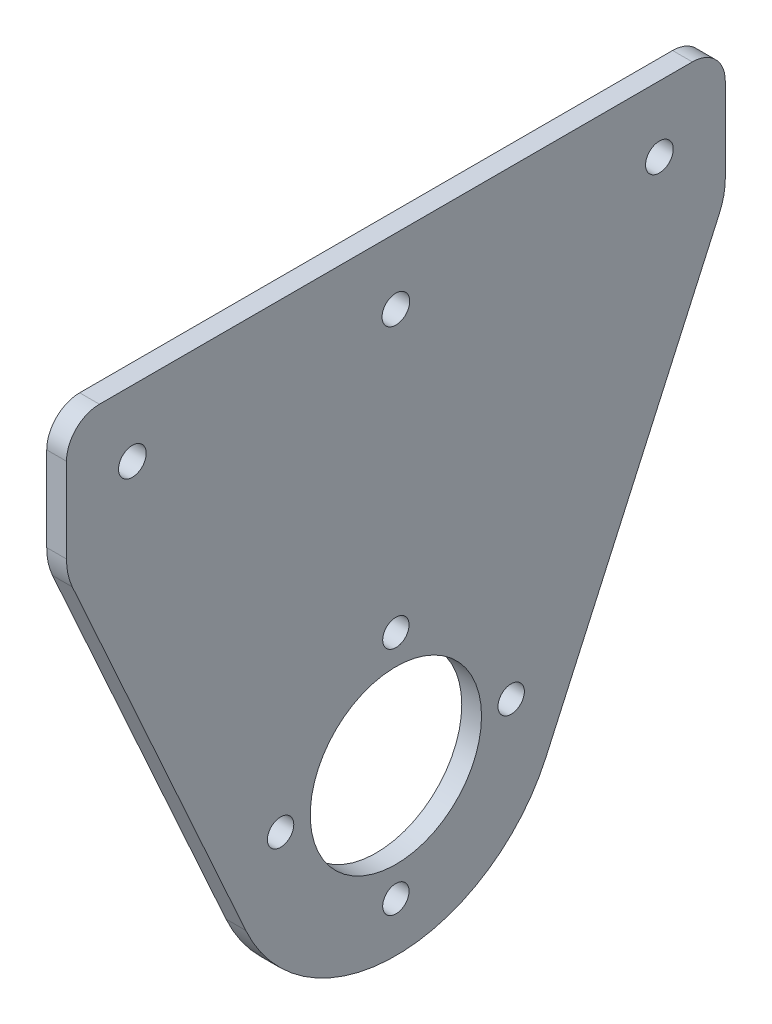
ISO-10303-21;
HEADER;
FILE_DESCRIPTION(('STEP AP214'),'2;1');
FILE_NAME('part.step','',(''),(''),'','','');
FILE_SCHEMA(('AUTOMOTIVE_DESIGN { 1 0 10303 214 1 1 1 1 }'));
ENDSEC;
DATA;
#1=APPLICATION_CONTEXT('core data for automotive mechanical design processes');
#2=APPLICATION_PROTOCOL_DEFINITION('international standard','automotive_design',2000,#1);
#3=PRODUCT_CONTEXT('',#1,'mechanical');
#4=PRODUCT('Part','Part','',(#3));
#5=PRODUCT_RELATED_PRODUCT_CATEGORY('part','',(#4));
#6=PRODUCT_DEFINITION_FORMATION('','',#4);
#7=PRODUCT_DEFINITION_CONTEXT('part definition',#1,'design');
#8=PRODUCT_DEFINITION('design','',#6,#7);
#9=PRODUCT_DEFINITION_SHAPE('','',#8);
#10=(LENGTH_UNIT() NAMED_UNIT(*) SI_UNIT(.MILLI.,.METRE.));
#11=(NAMED_UNIT(*) PLANE_ANGLE_UNIT() SI_UNIT($,.RADIAN.));
#12=(NAMED_UNIT(*) SI_UNIT($,.STERADIAN.) SOLID_ANGLE_UNIT());
#13=UNCERTAINTY_MEASURE_WITH_UNIT(LENGTH_MEASURE(1.E-05),#10,'distance_accuracy_value','');
#14=(GEOMETRIC_REPRESENTATION_CONTEXT(3) GLOBAL_UNCERTAINTY_ASSIGNED_CONTEXT((#13)) GLOBAL_UNIT_ASSIGNED_CONTEXT((#10,
#11,#12)) REPRESENTATION_CONTEXT('',''));
#15=CARTESIAN_POINT('',(0.,0.,0.));
#16=DIRECTION('',(0.,0.,1.));
#17=DIRECTION('',(1.,0.,0.));
#18=AXIS2_PLACEMENT_3D('',#15,#16,#17);
#19=CARTESIAN_POINT('',(3.,0.,0.));
#20=DIRECTION('',(-1.,0.,0.));
#21=DIRECTION('',(0.,0.,1.));
#22=AXIS2_PLACEMENT_3D('',#19,#20,#21);
#23=CYLINDRICAL_SURFACE('',#22,25.);
#24=CARTESIAN_POINT('',(3.,0.,0.));
#25=DIRECTION('',(1.,0.,0.));
#26=DIRECTION('',(0.,0.,-1.));
#27=AXIS2_PLACEMENT_3D('',#24,#25,#26);
#28=CIRCLE('',#27,25.);
#29=CARTESIAN_POINT('',(3.,-10.2859456941537,22.7859456941537));
#30=VERTEX_POINT('',#29);
#31=CARTESIAN_POINT('',(3.,-10.2859456941537,-22.7859456941537));
#32=VERTEX_POINT('',#31);
#33=EDGE_CURVE('E129',#30,#32,#28,.T.);
#34=ORIENTED_EDGE('',*,*,#33,.F.);
#35=DIRECTION('',(1.,0.,0.));
#36=VECTOR('',#35,1.);
#37=CARTESIAN_POINT('',(0.,-10.2859456941537,22.7859456941537));
#38=LINE('',#37,#36);
#39=CARTESIAN_POINT('',(0.,-10.2859456941537,22.7859456941537));
#40=VERTEX_POINT('',#39);
#41=EDGE_CURVE('E119',#40,#30,#38,.T.);
#42=ORIENTED_EDGE('',*,*,#41,.F.);
#43=CARTESIAN_POINT('',(0.,0.,0.));
#44=DIRECTION('',(1.,0.,0.));
#45=DIRECTION('',(0.,0.,-1.));
#46=AXIS2_PLACEMENT_3D('',#43,#44,#45);
#47=CIRCLE('',#46,25.);
#48=CARTESIAN_POINT('',(0.,-10.2859456941537,-22.7859456941537));
#49=VERTEX_POINT('',#48);
#50=EDGE_CURVE('E127',#40,#49,#47,.T.);
#51=ORIENTED_EDGE('',*,*,#50,.T.);
#52=DIRECTION('',(1.,0.,0.));
#53=VECTOR('',#52,1.);
#54=CARTESIAN_POINT('',(0.,-10.2859456941537,-22.7859456941537));
#55=LINE('',#54,#53);
#56=EDGE_CURVE('E273',#49,#32,#55,.T.);
#57=ORIENTED_EDGE('',*,*,#56,.T.);
#58=EDGE_LOOP('',(#34,#42,#51,#57));
#59=FACE_BOUND('',#58,.T.);
#60=ADVANCED_FACE('F41',(#59),#23,.T.);
#61=CARTESIAN_POINT('',(3.,0.,0.));
#62=DIRECTION('',(1.,0.,0.));
#63=DIRECTION('',(0.,0.,-1.));
#64=AXIS2_PLACEMENT_3D('',#61,#62,#63);
#65=PLANE('',#64);
#66=CARTESIAN_POINT('',(3.,60.,40.));
#67=DIRECTION('',(1.,0.,0.));
#68=DIRECTION('',(0.,0.,-1.));
#69=AXIS2_PLACEMENT_3D('',#66,#67,#68);
#70=CIRCLE('',#69,2.1);
#71=CARTESIAN_POINT('',(3.,60.,37.9));
#72=VERTEX_POINT('',#71);
#73=EDGE_CURVE('E467',#72,#72,#70,.T.);
#74=ORIENTED_EDGE('',*,*,#73,.F.);
#75=EDGE_LOOP('',(#74));
#76=FACE_BOUND('',#75,.T.);
#77=CARTESIAN_POINT('',(3.,60.,0.));
#78=DIRECTION('',(1.,0.,0.));
#79=DIRECTION('',(0.,0.,-1.));
#80=AXIS2_PLACEMENT_3D('',#77,#78,#79);
#81=CIRCLE('',#80,2.1);
#82=CARTESIAN_POINT('',(3.,60.,-2.1));
#83=VERTEX_POINT('',#82);
#84=EDGE_CURVE('E468',#83,#83,#81,.T.);
#85=ORIENTED_EDGE('',*,*,#84,.F.);
#86=EDGE_LOOP('',(#85));
#87=FACE_BOUND('',#86,.T.);
#88=CARTESIAN_POINT('',(3.,60.,-40.));
#89=DIRECTION('',(1.,0.,0.));
#90=DIRECTION('',(0.,0.,-1.));
#91=AXIS2_PLACEMENT_3D('',#88,#89,#90);
#92=CIRCLE('',#91,2.1);
#93=CARTESIAN_POINT('',(3.,60.,-42.1));
#94=VERTEX_POINT('',#93);
#95=EDGE_CURVE('E477',#94,#94,#92,.T.);
#96=ORIENTED_EDGE('',*,*,#95,.F.);
#97=EDGE_LOOP('',(#96));
#98=FACE_BOUND('',#97,.T.);
#99=DIRECTION('',(0.,0.911437827766148,-0.411437827766147));
#100=VECTOR('',#99,1.);
#101=CARTESIAN_POINT('',(3.,-10.2859456941537,-22.7859456941537));
#102=LINE('',#101,#100);
#103=CARTESIAN_POINT('',(3.,48.0381260925538,-49.1143782776615));
#104=VERTEX_POINT('',#103);
#105=EDGE_CURVE('E274',#32,#104,#102,.T.);
#106=ORIENTED_EDGE('',*,*,#105,.T.);
#107=CARTESIAN_POINT('',(3.,52.1525043702153,-40.));
#108=DIRECTION('',(1.,0.,0.));
#109=DIRECTION('',(0.,0.,-1.));
#110=AXIS2_PLACEMENT_3D('',#107,#108,#109);
#111=CIRCLE('',#110,10.);
#112=CARTESIAN_POINT('',(3.,52.1525043702153,-50.));
#113=VERTEX_POINT('',#112);
#114=EDGE_CURVE('E170',#104,#113,#111,.T.);
#115=ORIENTED_EDGE('',*,*,#114,.T.);
#116=DIRECTION('',(0.,1.,0.));
#117=VECTOR('',#116,1.);
#118=CARTESIAN_POINT('',(3.,70.,-50.));
#119=LINE('',#118,#117);
#120=CARTESIAN_POINT('',(3.,65.,-50.));
#121=VERTEX_POINT('',#120);
#122=EDGE_CURVE('E190',#113,#121,#119,.T.);
#123=ORIENTED_EDGE('',*,*,#122,.T.);
#124=CARTESIAN_POINT('',(3.,65.,-45.));
#125=DIRECTION('',(1.,0.,0.));
#126=DIRECTION('',(0.,0.,-1.));
#127=AXIS2_PLACEMENT_3D('',#124,#125,#126);
#128=CIRCLE('',#127,5.);
#129=CARTESIAN_POINT('',(3.,70.,-45.));
#130=VERTEX_POINT('',#129);
#131=EDGE_CURVE('E151',#121,#130,#128,.T.);
#132=ORIENTED_EDGE('',*,*,#131,.T.);
#133=DIRECTION('',(0.,0.,1.));
#134=VECTOR('',#133,1.);
#135=CARTESIAN_POINT('',(3.,70.,25.));
#136=LINE('',#135,#134);
#137=CARTESIAN_POINT('',(3.,70.,45.));
#138=VERTEX_POINT('',#137);
#139=EDGE_CURVE('E201',#130,#138,#136,.T.);
#140=ORIENTED_EDGE('',*,*,#139,.T.);
#141=CARTESIAN_POINT('',(3.,65.,45.));
#142=DIRECTION('',(1.,0.,0.));
#143=DIRECTION('',(0.,0.,-1.));
#144=AXIS2_PLACEMENT_3D('',#141,#142,#143);
#145=CIRCLE('',#144,5.);
#146=CARTESIAN_POINT('',(3.,65.,50.));
#147=VERTEX_POINT('',#146);
#148=EDGE_CURVE('E149',#138,#147,#145,.T.);
#149=ORIENTED_EDGE('',*,*,#148,.T.);
#150=DIRECTION('',(0.,-1.,0.));
#151=VECTOR('',#150,1.);
#152=CARTESIAN_POINT('',(3.,70.,50.));
#153=LINE('',#152,#151);
#154=CARTESIAN_POINT('',(3.,52.1525043702153,50.));
#155=VERTEX_POINT('',#154);
#156=EDGE_CURVE('E130',#147,#155,#153,.T.);
#157=ORIENTED_EDGE('',*,*,#156,.T.);
#158=CARTESIAN_POINT('',(3.,52.1525043702153,40.));
#159=DIRECTION('',(1.,0.,0.));
#160=DIRECTION('',(0.,0.,-1.));
#161=AXIS2_PLACEMENT_3D('',#158,#159,#160);
#162=CIRCLE('',#161,10.);
#163=CARTESIAN_POINT('',(3.,48.0381260925538,49.1143782776615));
#164=VERTEX_POINT('',#163);
#165=EDGE_CURVE('E168',#155,#164,#162,.T.);
#166=ORIENTED_EDGE('',*,*,#165,.T.);
#167=DIRECTION('',(0.,-0.911437827766148,-0.411437827766148));
#168=VECTOR('',#167,1.);
#169=CARTESIAN_POINT('',(3.,-10.2859456941537,22.7859456941537));
#170=LINE('',#169,#168);
#171=EDGE_CURVE('E122',#164,#30,#170,.T.);
#172=ORIENTED_EDGE('',*,*,#171,.T.);
#173=ORIENTED_EDGE('',*,*,#33,.T.);
#174=EDGE_LOOP('',(#106,#115,#123,#132,#140,#149,#157,#166,#172,#173));
#175=FACE_BOUND('',#174,.T.);
#176=CARTESIAN_POINT('',(3.,17.5,0.));
#177=DIRECTION('',(1.,0.,0.));
#178=DIRECTION('',(0.,0.,-1.));
#179=AXIS2_PLACEMENT_3D('',#176,#177,#178);
#180=CIRCLE('',#179,2.);
#181=CARTESIAN_POINT('',(3.,17.5,-2.));
#182=VERTEX_POINT('',#181);
#183=EDGE_CURVE('E206',#182,#182,#180,.T.);
#184=ORIENTED_EDGE('',*,*,#183,.F.);
#185=EDGE_LOOP('',(#184));
#186=FACE_BOUND('',#185,.T.);
#187=CARTESIAN_POINT('',(3.,0.,-17.5));
#188=DIRECTION('',(1.,0.,0.));
#189=DIRECTION('',(0.,0.,-1.));
#190=AXIS2_PLACEMENT_3D('',#187,#188,#189);
#191=CIRCLE('',#190,2.);
#192=CARTESIAN_POINT('',(3.,0.,-19.5));
#193=VERTEX_POINT('',#192);
#194=EDGE_CURVE('E209',#193,#193,#191,.T.);
#195=ORIENTED_EDGE('',*,*,#194,.F.);
#196=EDGE_LOOP('',(#195));
#197=FACE_BOUND('',#196,.T.);
#198=CARTESIAN_POINT('',(3.,-17.5,0.));
#199=DIRECTION('',(1.,0.,0.));
#200=DIRECTION('',(0.,0.,-1.));
#201=AXIS2_PLACEMENT_3D('',#198,#199,#200);
#202=CIRCLE('',#201,2.);
#203=CARTESIAN_POINT('',(3.,-17.5,-2.));
#204=VERTEX_POINT('',#203);
#205=EDGE_CURVE('E215',#204,#204,#202,.T.);
#206=ORIENTED_EDGE('',*,*,#205,.F.);
#207=EDGE_LOOP('',(#206));
#208=FACE_BOUND('',#207,.T.);
#209=CARTESIAN_POINT('',(3.,0.,17.5));
#210=DIRECTION('',(1.,0.,0.));
#211=DIRECTION('',(0.,0.,-1.));
#212=AXIS2_PLACEMENT_3D('',#209,#210,#211);
#213=CIRCLE('',#212,2.);
#214=CARTESIAN_POINT('',(3.,0.,15.5));
#215=VERTEX_POINT('',#214);
#216=EDGE_CURVE('E221',#215,#215,#213,.T.);
#217=ORIENTED_EDGE('',*,*,#216,.F.);
#218=EDGE_LOOP('',(#217));
#219=FACE_BOUND('',#218,.T.);
#220=CARTESIAN_POINT('',(3.,0.,0.));
#221=DIRECTION('',(1.,0.,0.));
#222=DIRECTION('',(0.,0.,-1.));
#223=AXIS2_PLACEMENT_3D('',#220,#221,#222);
#224=CIRCLE('',#223,13.);
#225=CARTESIAN_POINT('',(3.,0.,-13.));
#226=VERTEX_POINT('',#225);
#227=EDGE_CURVE('E138',#226,#226,#224,.T.);
#228=ORIENTED_EDGE('',*,*,#227,.F.);
#229=EDGE_LOOP('',(#228));
#230=FACE_BOUND('',#229,.T.);
#231=ADVANCED_FACE('F187',(#76,#87,#98,#175,#186,#197,#208,#219,#230),#65,.T.);
#232=CARTESIAN_POINT('',(0.,0.,0.));
#233=DIRECTION('',(1.,0.,0.));
#234=DIRECTION('',(0.,0.,-1.));
#235=AXIS2_PLACEMENT_3D('',#232,#233,#234);
#236=PLANE('',#235);
#237=CARTESIAN_POINT('',(0.,60.,40.));
#238=DIRECTION('',(1.,0.,0.));
#239=DIRECTION('',(0.,0.,-1.));
#240=AXIS2_PLACEMENT_3D('',#237,#238,#239);
#241=CIRCLE('',#240,2.1);
#242=CARTESIAN_POINT('',(0.,60.,37.9));
#243=VERTEX_POINT('',#242);
#244=EDGE_CURVE('E277',#243,#243,#241,.T.);
#245=ORIENTED_EDGE('',*,*,#244,.T.);
#246=EDGE_LOOP('',(#245));
#247=FACE_BOUND('',#246,.T.);
#248=CARTESIAN_POINT('',(0.,60.,0.));
#249=DIRECTION('',(1.,0.,0.));
#250=DIRECTION('',(0.,0.,-1.));
#251=AXIS2_PLACEMENT_3D('',#248,#249,#250);
#252=CIRCLE('',#251,2.1);
#253=CARTESIAN_POINT('',(0.,60.,-2.1));
#254=VERTEX_POINT('',#253);
#255=EDGE_CURVE('E472',#254,#254,#252,.T.);
#256=ORIENTED_EDGE('',*,*,#255,.T.);
#257=EDGE_LOOP('',(#256));
#258=FACE_BOUND('',#257,.T.);
#259=CARTESIAN_POINT('',(0.,60.,-40.));
#260=DIRECTION('',(1.,0.,0.));
#261=DIRECTION('',(0.,0.,-1.));
#262=AXIS2_PLACEMENT_3D('',#259,#260,#261);
#263=CIRCLE('',#262,2.1);
#264=CARTESIAN_POINT('',(0.,60.,-42.1));
#265=VERTEX_POINT('',#264);
#266=EDGE_CURVE('E480',#265,#265,#263,.T.);
#267=ORIENTED_EDGE('',*,*,#266,.T.);
#268=EDGE_LOOP('',(#267));
#269=FACE_BOUND('',#268,.T.);
#270=DIRECTION('',(0.,1.,0.));
#271=VECTOR('',#270,1.);
#272=CARTESIAN_POINT('',(0.,70.,-50.));
#273=LINE('',#272,#271);
#274=CARTESIAN_POINT('',(0.,52.1525043702153,-50.));
#275=VERTEX_POINT('',#274);
#276=CARTESIAN_POINT('',(0.,65.,-50.));
#277=VERTEX_POINT('',#276);
#278=EDGE_CURVE('E194',#275,#277,#273,.T.);
#279=ORIENTED_EDGE('',*,*,#278,.F.);
#280=CARTESIAN_POINT('',(0.,52.1525043702153,-40.));
#281=DIRECTION('',(1.,0.,0.));
#282=DIRECTION('',(0.,0.,-1.));
#283=AXIS2_PLACEMENT_3D('',#280,#281,#282);
#284=CIRCLE('',#283,10.);
#285=CARTESIAN_POINT('',(0.,48.0381260925538,-49.1143782776615));
#286=VERTEX_POINT('',#285);
#287=EDGE_CURVE('E175',#275,#286,#284,.F.);
#288=ORIENTED_EDGE('',*,*,#287,.T.);
#289=DIRECTION('',(0.,0.911437827766148,-0.411437827766147));
#290=VECTOR('',#289,1.);
#291=CARTESIAN_POINT('',(0.,-10.2859456941537,-22.7859456941537));
#292=LINE('',#291,#290);
#293=EDGE_CURVE('E137',#49,#286,#292,.T.);
#294=ORIENTED_EDGE('',*,*,#293,.F.);
#295=ORIENTED_EDGE('',*,*,#50,.F.);
#296=DIRECTION('',(0.,-0.911437827766148,-0.411437827766148));
#297=VECTOR('',#296,1.);
#298=CARTESIAN_POINT('',(0.,-10.2859456941537,22.7859456941537));
#299=LINE('',#298,#297);
#300=CARTESIAN_POINT('',(0.,48.0381260925538,49.1143782776615));
#301=VERTEX_POINT('',#300);
#302=EDGE_CURVE('E116',#301,#40,#299,.T.);
#303=ORIENTED_EDGE('',*,*,#302,.F.);
#304=CARTESIAN_POINT('',(0.,52.1525043702153,40.));
#305=DIRECTION('',(1.,0.,0.));
#306=DIRECTION('',(0.,0.,-1.));
#307=AXIS2_PLACEMENT_3D('',#304,#305,#306);
#308=CIRCLE('',#307,10.);
#309=CARTESIAN_POINT('',(0.,52.1525043702153,50.));
#310=VERTEX_POINT('',#309);
#311=EDGE_CURVE('E56',#301,#310,#308,.F.);
#312=ORIENTED_EDGE('',*,*,#311,.T.);
#313=DIRECTION('',(0.,-1.,0.));
#314=VECTOR('',#313,1.);
#315=CARTESIAN_POINT('',(0.,70.,50.));
#316=LINE('',#315,#314);
#317=CARTESIAN_POINT('',(0.,65.,50.));
#318=VERTEX_POINT('',#317);
#319=EDGE_CURVE('E183',#318,#310,#316,.T.);
#320=ORIENTED_EDGE('',*,*,#319,.F.);
#321=CARTESIAN_POINT('',(0.,65.,45.));
#322=DIRECTION('',(1.,0.,0.));
#323=DIRECTION('',(0.,0.,-1.));
#324=AXIS2_PLACEMENT_3D('',#321,#322,#323);
#325=CIRCLE('',#324,5.);
#326=CARTESIAN_POINT('',(0.,70.,45.));
#327=VERTEX_POINT('',#326);
#328=EDGE_CURVE('E158',#318,#327,#325,.F.);
#329=ORIENTED_EDGE('',*,*,#328,.T.);
#330=DIRECTION('',(0.,0.,1.));
#331=VECTOR('',#330,1.);
#332=CARTESIAN_POINT('',(0.,70.,25.));
#333=LINE('',#332,#331);
#334=CARTESIAN_POINT('',(0.,70.,-45.));
#335=VERTEX_POINT('',#334);
#336=EDGE_CURVE('E197',#335,#327,#333,.T.);
#337=ORIENTED_EDGE('',*,*,#336,.F.);
#338=CARTESIAN_POINT('',(0.,65.,-45.));
#339=DIRECTION('',(1.,0.,0.));
#340=DIRECTION('',(0.,0.,-1.));
#341=AXIS2_PLACEMENT_3D('',#338,#339,#340);
#342=CIRCLE('',#341,5.);
#343=EDGE_CURVE('E160',#335,#277,#342,.F.);
#344=ORIENTED_EDGE('',*,*,#343,.T.);
#345=EDGE_LOOP('',(#279,#288,#294,#295,#303,#312,#320,#329,#337,#344));
#346=FACE_BOUND('',#345,.T.);
#347=CARTESIAN_POINT('',(0.,17.5,0.));
#348=DIRECTION('',(1.,0.,0.));
#349=DIRECTION('',(0.,0.,-1.));
#350=AXIS2_PLACEMENT_3D('',#347,#348,#349);
#351=CIRCLE('',#350,2.);
#352=CARTESIAN_POINT('',(0.,17.5,-2.));
#353=VERTEX_POINT('',#352);
#354=EDGE_CURVE('E203',#353,#353,#351,.T.);
#355=ORIENTED_EDGE('',*,*,#354,.T.);
#356=EDGE_LOOP('',(#355));
#357=FACE_BOUND('',#356,.T.);
#358=CARTESIAN_POINT('',(0.,0.,-17.5));
#359=DIRECTION('',(1.,0.,0.));
#360=DIRECTION('',(0.,0.,-1.));
#361=AXIS2_PLACEMENT_3D('',#358,#359,#360);
#362=CIRCLE('',#361,2.);
#363=CARTESIAN_POINT('',(0.,0.,-19.5));
#364=VERTEX_POINT('',#363);
#365=EDGE_CURVE('E212',#364,#364,#362,.T.);
#366=ORIENTED_EDGE('',*,*,#365,.T.);
#367=EDGE_LOOP('',(#366));
#368=FACE_BOUND('',#367,.T.);
#369=CARTESIAN_POINT('',(0.,-17.5,0.));
#370=DIRECTION('',(1.,0.,0.));
#371=DIRECTION('',(0.,0.,-1.));
#372=AXIS2_PLACEMENT_3D('',#369,#370,#371);
#373=CIRCLE('',#372,2.);
#374=CARTESIAN_POINT('',(0.,-17.5,-2.));
#375=VERTEX_POINT('',#374);
#376=EDGE_CURVE('E218',#375,#375,#373,.T.);
#377=ORIENTED_EDGE('',*,*,#376,.T.);
#378=EDGE_LOOP('',(#377));
#379=FACE_BOUND('',#378,.T.);
#380=CARTESIAN_POINT('',(0.,0.,17.5));
#381=DIRECTION('',(1.,0.,0.));
#382=DIRECTION('',(0.,0.,-1.));
#383=AXIS2_PLACEMENT_3D('',#380,#381,#382);
#384=CIRCLE('',#383,2.);
#385=CARTESIAN_POINT('',(0.,0.,15.5));
#386=VERTEX_POINT('',#385);
#387=EDGE_CURVE('E200',#386,#386,#384,.T.);
#388=ORIENTED_EDGE('',*,*,#387,.T.);
#389=EDGE_LOOP('',(#388));
#390=FACE_BOUND('',#389,.T.);
#391=CARTESIAN_POINT('',(0.,0.,0.));
#392=DIRECTION('',(1.,0.,0.));
#393=DIRECTION('',(0.,0.,-1.));
#394=AXIS2_PLACEMENT_3D('',#391,#392,#393);
#395=CIRCLE('',#394,13.);
#396=CARTESIAN_POINT('',(0.,0.,-13.));
#397=VERTEX_POINT('',#396);
#398=EDGE_CURVE('E143',#397,#397,#395,.T.);
#399=ORIENTED_EDGE('',*,*,#398,.T.);
#400=EDGE_LOOP('',(#399));
#401=FACE_BOUND('',#400,.T.);
#402=ADVANCED_FACE('F134',(#247,#258,#269,#346,#357,#368,#379,#390,#401),#236,.F.);
#403=CARTESIAN_POINT('',(3.,0.,0.));
#404=DIRECTION('',(-1.,0.,0.));
#405=DIRECTION('',(0.,0.,1.));
#406=AXIS2_PLACEMENT_3D('',#403,#404,#405);
#407=CYLINDRICAL_SURFACE('',#406,13.);
#408=ORIENTED_EDGE('',*,*,#227,.T.);
#409=EDGE_LOOP('',(#408));
#410=FACE_BOUND('',#409,.T.);
#411=ORIENTED_EDGE('',*,*,#398,.F.);
#412=EDGE_LOOP('',(#411));
#413=FACE_BOUND('',#412,.T.);
#414=ADVANCED_FACE('F229',(#410,#413),#407,.F.);
#415=CARTESIAN_POINT('',(0.,0.,17.5));
#416=DIRECTION('',(1.,0.,0.));
#417=DIRECTION('',(0.,0.,-1.));
#418=AXIS2_PLACEMENT_3D('',#415,#416,#417);
#419=CYLINDRICAL_SURFACE('',#418,2.);
#420=ORIENTED_EDGE('',*,*,#387,.F.);
#421=EDGE_LOOP('',(#420));
#422=FACE_BOUND('',#421,.T.);
#423=ORIENTED_EDGE('',*,*,#216,.T.);
#424=EDGE_LOOP('',(#423));
#425=FACE_BOUND('',#424,.T.);
#426=ADVANCED_FACE('F231',(#422,#425),#419,.F.);
#427=CARTESIAN_POINT('',(0.,-17.5,0.));
#428=DIRECTION('',(1.,0.,0.));
#429=DIRECTION('',(0.,0.,-1.));
#430=AXIS2_PLACEMENT_3D('',#427,#428,#429);
#431=CYLINDRICAL_SURFACE('',#430,2.);
#432=ORIENTED_EDGE('',*,*,#376,.F.);
#433=EDGE_LOOP('',(#432));
#434=FACE_BOUND('',#433,.T.);
#435=ORIENTED_EDGE('',*,*,#205,.T.);
#436=EDGE_LOOP('',(#435));
#437=FACE_BOUND('',#436,.T.);
#438=ADVANCED_FACE('F237',(#434,#437),#431,.F.);
#439=CARTESIAN_POINT('',(0.,0.,-17.5));
#440=DIRECTION('',(1.,0.,0.));
#441=DIRECTION('',(0.,0.,-1.));
#442=AXIS2_PLACEMENT_3D('',#439,#440,#441);
#443=CYLINDRICAL_SURFACE('',#442,2.);
#444=ORIENTED_EDGE('',*,*,#365,.F.);
#445=EDGE_LOOP('',(#444));
#446=FACE_BOUND('',#445,.T.);
#447=ORIENTED_EDGE('',*,*,#194,.T.);
#448=EDGE_LOOP('',(#447));
#449=FACE_BOUND('',#448,.T.);
#450=ADVANCED_FACE('F300',(#446,#449),#443,.F.);
#451=CARTESIAN_POINT('',(0.,17.5,0.));
#452=DIRECTION('',(1.,0.,0.));
#453=DIRECTION('',(0.,0.,-1.));
#454=AXIS2_PLACEMENT_3D('',#451,#452,#453);
#455=CYLINDRICAL_SURFACE('',#454,2.);
#456=ORIENTED_EDGE('',*,*,#354,.F.);
#457=EDGE_LOOP('',(#456));
#458=FACE_BOUND('',#457,.T.);
#459=ORIENTED_EDGE('',*,*,#183,.T.);
#460=EDGE_LOOP('',(#459));
#461=FACE_BOUND('',#460,.T.);
#462=ADVANCED_FACE('F293',(#458,#461),#455,.F.);
#463=CARTESIAN_POINT('',(0.,70.,25.));
#464=DIRECTION('',(0.,1.,0.));
#465=DIRECTION('',(0.,0.,1.));
#466=AXIS2_PLACEMENT_3D('',#463,#464,#465);
#467=PLANE('',#466);
#468=ORIENTED_EDGE('',*,*,#139,.F.);
#469=DIRECTION('',(1.,0.,0.));
#470=VECTOR('',#469,1.);
#471=CARTESIAN_POINT('',(0.,70.,-45.));
#472=LINE('',#471,#470);
#473=EDGE_CURVE('E156',#130,#335,#472,.F.);
#474=ORIENTED_EDGE('',*,*,#473,.T.);
#475=ORIENTED_EDGE('',*,*,#336,.T.);
#476=DIRECTION('',(1.,0.,0.));
#477=VECTOR('',#476,1.);
#478=CARTESIAN_POINT('',(0.,70.,45.));
#479=LINE('',#478,#477);
#480=EDGE_CURVE('E153',#327,#138,#479,.T.);
#481=ORIENTED_EDGE('',*,*,#480,.T.);
#482=EDGE_LOOP('',(#468,#474,#475,#481));
#483=FACE_BOUND('',#482,.T.);
#484=ADVANCED_FACE('F289',(#483),#467,.T.);
#485=CARTESIAN_POINT('',(0.,70.,-50.));
#486=DIRECTION('',(0.,0.,-1.));
#487=DIRECTION('',(-1.,0.,0.));
#488=AXIS2_PLACEMENT_3D('',#485,#486,#487);
#489=PLANE('',#488);
#490=ORIENTED_EDGE('',*,*,#122,.F.);
#491=DIRECTION('',(1.,0.,0.));
#492=VECTOR('',#491,1.);
#493=CARTESIAN_POINT('',(0.,52.1525043702153,-50.));
#494=LINE('',#493,#492);
#495=EDGE_CURVE('E172',#113,#275,#494,.F.);
#496=ORIENTED_EDGE('',*,*,#495,.T.);
#497=ORIENTED_EDGE('',*,*,#278,.T.);
#498=DIRECTION('',(1.,0.,0.));
#499=VECTOR('',#498,1.);
#500=CARTESIAN_POINT('',(0.,65.,-50.));
#501=LINE('',#500,#499);
#502=EDGE_CURVE('E140',#277,#121,#501,.T.);
#503=ORIENTED_EDGE('',*,*,#502,.T.);
#504=EDGE_LOOP('',(#490,#496,#497,#503));
#505=FACE_BOUND('',#504,.T.);
#506=ADVANCED_FACE('F281',(#505),#489,.T.);
#507=CARTESIAN_POINT('',(0.,70.,50.));
#508=DIRECTION('',(0.,0.,1.));
#509=DIRECTION('',(1.,0.,0.));
#510=AXIS2_PLACEMENT_3D('',#507,#508,#509);
#511=PLANE('',#510);
#512=ORIENTED_EDGE('',*,*,#319,.T.);
#513=DIRECTION('',(1.,0.,0.));
#514=VECTOR('',#513,1.);
#515=CARTESIAN_POINT('',(0.,52.1525043702153,50.));
#516=LINE('',#515,#514);
#517=EDGE_CURVE('E49',#310,#155,#516,.T.);
#518=ORIENTED_EDGE('',*,*,#517,.T.);
#519=ORIENTED_EDGE('',*,*,#156,.F.);
#520=DIRECTION('',(1.,0.,0.));
#521=VECTOR('',#520,1.);
#522=CARTESIAN_POINT('',(0.,65.,50.));
#523=LINE('',#522,#521);
#524=EDGE_CURVE('E163',#147,#318,#523,.F.);
#525=ORIENTED_EDGE('',*,*,#524,.T.);
#526=EDGE_LOOP('',(#512,#518,#519,#525));
#527=FACE_BOUND('',#526,.T.);
#528=ADVANCED_FACE('F181',(#527),#511,.T.);
#529=CARTESIAN_POINT('',(0.,-10.2859456941537,22.7859456941537));
#530=DIRECTION('',(0.,-0.411437827766148,0.911437827766148));
#531=DIRECTION('',(0.,-0.911437827766148,-0.411437827766148));
#532=AXIS2_PLACEMENT_3D('',#529,#530,#531);
#533=PLANE('',#532);
#534=ORIENTED_EDGE('',*,*,#171,.F.);
#535=DIRECTION('',(1.,0.,0.));
#536=VECTOR('',#535,1.);
#537=CARTESIAN_POINT('',(0.,48.0381260925538,49.1143782776615));
#538=LINE('',#537,#536);
#539=EDGE_CURVE('E11',#164,#301,#538,.F.);
#540=ORIENTED_EDGE('',*,*,#539,.T.);
#541=ORIENTED_EDGE('',*,*,#302,.T.);
#542=ORIENTED_EDGE('',*,*,#41,.T.);
#543=EDGE_LOOP('',(#534,#540,#541,#542));
#544=FACE_BOUND('',#543,.T.);
#545=ADVANCED_FACE('F118',(#544),#533,.T.);
#546=CARTESIAN_POINT('',(0.,-10.2859456941537,-22.7859456941537));
#547=DIRECTION('',(0.,-0.411437827766147,-0.911437827766148));
#548=DIRECTION('',(0.,0.911437827766148,-0.411437827766148));
#549=AXIS2_PLACEMENT_3D('',#546,#547,#548);
#550=PLANE('',#549);
#551=ORIENTED_EDGE('',*,*,#293,.T.);
#552=DIRECTION('',(1.,0.,0.));
#553=VECTOR('',#552,1.);
#554=CARTESIAN_POINT('',(0.,48.0381260925538,-49.1143782776615));
#555=LINE('',#554,#553);
#556=EDGE_CURVE('E165',#286,#104,#555,.T.);
#557=ORIENTED_EDGE('',*,*,#556,.T.);
#558=ORIENTED_EDGE('',*,*,#105,.F.);
#559=ORIENTED_EDGE('',*,*,#56,.F.);
#560=EDGE_LOOP('',(#551,#557,#558,#559));
#561=FACE_BOUND('',#560,.T.);
#562=ADVANCED_FACE('F272',(#561),#550,.T.);
#563=CARTESIAN_POINT('',(0.,60.,-40.));
#564=DIRECTION('',(1.,0.,0.));
#565=DIRECTION('',(0.,0.,-1.));
#566=AXIS2_PLACEMENT_3D('',#563,#564,#565);
#567=CYLINDRICAL_SURFACE('',#566,2.1);
#568=ORIENTED_EDGE('',*,*,#266,.F.);
#569=EDGE_LOOP('',(#568));
#570=FACE_BOUND('',#569,.T.);
#571=ORIENTED_EDGE('',*,*,#95,.T.);
#572=EDGE_LOOP('',(#571));
#573=FACE_BOUND('',#572,.T.);
#574=ADVANCED_FACE('F411',(#570,#573),#567,.F.);
#575=CARTESIAN_POINT('',(0.,60.,0.));
#576=DIRECTION('',(1.,0.,0.));
#577=DIRECTION('',(0.,0.,-1.));
#578=AXIS2_PLACEMENT_3D('',#575,#576,#577);
#579=CYLINDRICAL_SURFACE('',#578,2.1);
#580=ORIENTED_EDGE('',*,*,#255,.F.);
#581=EDGE_LOOP('',(#580));
#582=FACE_BOUND('',#581,.T.);
#583=ORIENTED_EDGE('',*,*,#84,.T.);
#584=EDGE_LOOP('',(#583));
#585=FACE_BOUND('',#584,.T.);
#586=ADVANCED_FACE('F419',(#582,#585),#579,.F.);
#587=CARTESIAN_POINT('',(0.,60.,40.));
#588=DIRECTION('',(1.,0.,0.));
#589=DIRECTION('',(0.,0.,-1.));
#590=AXIS2_PLACEMENT_3D('',#587,#588,#589);
#591=CYLINDRICAL_SURFACE('',#590,2.1);
#592=ORIENTED_EDGE('',*,*,#244,.F.);
#593=EDGE_LOOP('',(#592));
#594=FACE_BOUND('',#593,.T.);
#595=ORIENTED_EDGE('',*,*,#73,.T.);
#596=EDGE_LOOP('',(#595));
#597=FACE_BOUND('',#596,.T.);
#598=ADVANCED_FACE('F257',(#594,#597),#591,.F.);
#599=CARTESIAN_POINT('',(0.,65.,-45.));
#600=DIRECTION('',(1.,0.,0.));
#601=DIRECTION('',(0.,0.,-1.));
#602=AXIS2_PLACEMENT_3D('',#599,#600,#601);
#603=CYLINDRICAL_SURFACE('',#602,5.);
#604=ORIENTED_EDGE('',*,*,#343,.F.);
#605=ORIENTED_EDGE('',*,*,#473,.F.);
#606=ORIENTED_EDGE('',*,*,#131,.F.);
#607=ORIENTED_EDGE('',*,*,#502,.F.);
#608=EDGE_LOOP('',(#604,#605,#606,#607));
#609=FACE_BOUND('',#608,.T.);
#610=ADVANCED_FACE('F253',(#609),#603,.T.);
#611=CARTESIAN_POINT('',(0.,65.,45.));
#612=DIRECTION('',(1.,0.,0.));
#613=DIRECTION('',(0.,0.,-1.));
#614=AXIS2_PLACEMENT_3D('',#611,#612,#613);
#615=CYLINDRICAL_SURFACE('',#614,5.);
#616=ORIENTED_EDGE('',*,*,#328,.F.);
#617=ORIENTED_EDGE('',*,*,#524,.F.);
#618=ORIENTED_EDGE('',*,*,#148,.F.);
#619=ORIENTED_EDGE('',*,*,#480,.F.);
#620=EDGE_LOOP('',(#616,#617,#618,#619));
#621=FACE_BOUND('',#620,.T.);
#622=ADVANCED_FACE('F256',(#621),#615,.T.);
#623=CARTESIAN_POINT('',(0.,52.1525043702153,-40.));
#624=DIRECTION('',(1.,0.,0.));
#625=DIRECTION('',(0.,0.,-1.));
#626=AXIS2_PLACEMENT_3D('',#623,#624,#625);
#627=CYLINDRICAL_SURFACE('',#626,10.);
#628=ORIENTED_EDGE('',*,*,#287,.F.);
#629=ORIENTED_EDGE('',*,*,#495,.F.);
#630=ORIENTED_EDGE('',*,*,#114,.F.);
#631=ORIENTED_EDGE('',*,*,#556,.F.);
#632=EDGE_LOOP('',(#628,#629,#630,#631));
#633=FACE_BOUND('',#632,.T.);
#634=ADVANCED_FACE('F260',(#633),#627,.T.);
#635=CARTESIAN_POINT('',(0.,52.1525043702153,40.));
#636=DIRECTION('',(1.,0.,0.));
#637=DIRECTION('',(0.,0.,-1.));
#638=AXIS2_PLACEMENT_3D('',#635,#636,#637);
#639=CYLINDRICAL_SURFACE('',#638,10.);
#640=ORIENTED_EDGE('',*,*,#311,.F.);
#641=ORIENTED_EDGE('',*,*,#539,.F.);
#642=ORIENTED_EDGE('',*,*,#165,.F.);
#643=ORIENTED_EDGE('',*,*,#517,.F.);
#644=EDGE_LOOP('',(#640,#641,#642,#643));
#645=FACE_BOUND('',#644,.T.);
#646=ADVANCED_FACE('F43',(#645),#639,.T.);
#647=CLOSED_SHELL('',(#60,#231,#402,#414,#426,#438,#450,#462,#484,#506,#528,#545,#562,#574,#586,
#598,#610,#622,#634,#646));
#648=MANIFOLD_SOLID_BREP('B2',#647);
#649=ADVANCED_BREP_SHAPE_REPRESENTATION('',(#18,#648),#14);
#650=SHAPE_DEFINITION_REPRESENTATION(#9,#649);
ENDSEC;
END-ISO-10303-21;
